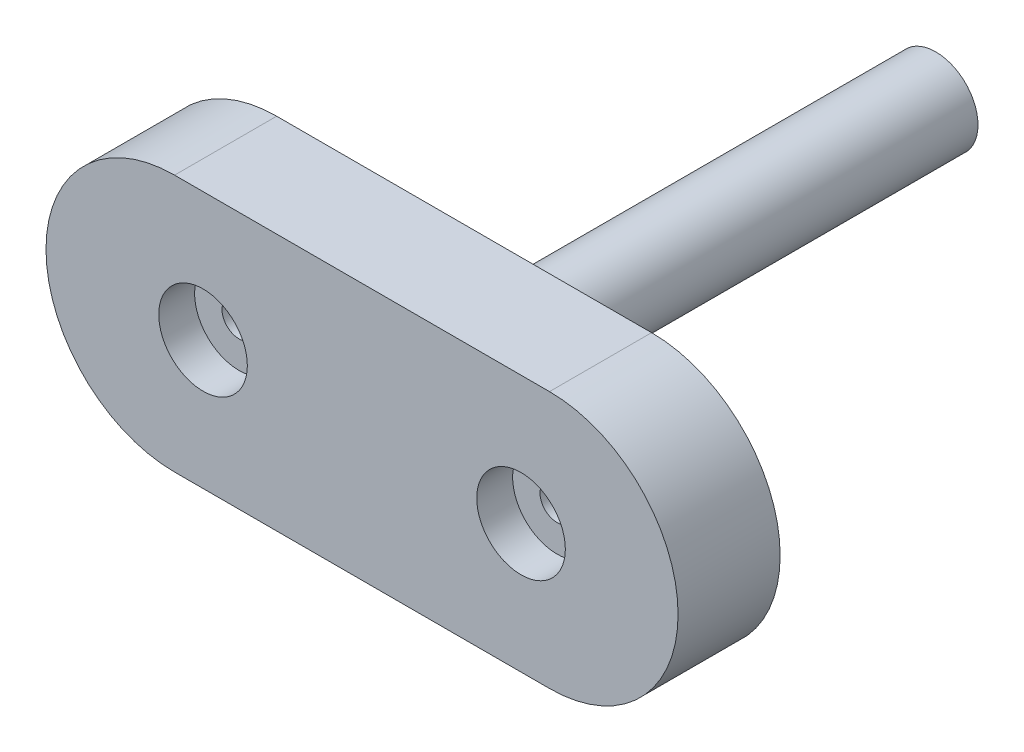
ISO-10303-21;
HEADER;
FILE_DESCRIPTION(('STEP AP214'),'2;1');
FILE_NAME('part.step','',(''),(''),'','','');
FILE_SCHEMA(('AUTOMOTIVE_DESIGN { 1 0 10303 214 1 1 1 1 }'));
ENDSEC;
DATA;
#1=APPLICATION_CONTEXT('core data for automotive mechanical design processes');
#2=APPLICATION_PROTOCOL_DEFINITION('international standard','automotive_design',2000,#1);
#3=PRODUCT_CONTEXT('',#1,'mechanical');
#4=PRODUCT('Part','Part','',(#3));
#5=PRODUCT_RELATED_PRODUCT_CATEGORY('part','',(#4));
#6=PRODUCT_DEFINITION_FORMATION('','',#4);
#7=PRODUCT_DEFINITION_CONTEXT('part definition',#1,'design');
#8=PRODUCT_DEFINITION('design','',#6,#7);
#9=PRODUCT_DEFINITION_SHAPE('','',#8);
#10=(LENGTH_UNIT() NAMED_UNIT(*) SI_UNIT(.MILLI.,.METRE.));
#11=(NAMED_UNIT(*) PLANE_ANGLE_UNIT() SI_UNIT($,.RADIAN.));
#12=(NAMED_UNIT(*) SI_UNIT($,.STERADIAN.) SOLID_ANGLE_UNIT());
#13=UNCERTAINTY_MEASURE_WITH_UNIT(LENGTH_MEASURE(1.E-05),#10,'distance_accuracy_value','');
#14=(GEOMETRIC_REPRESENTATION_CONTEXT(3) GLOBAL_UNCERTAINTY_ASSIGNED_CONTEXT((#13)) GLOBAL_UNIT_ASSIGNED_CONTEXT((#10,
#11,#12)) REPRESENTATION_CONTEXT('',''));
#15=CARTESIAN_POINT('',(0.,0.,0.));
#16=DIRECTION('',(0.,0.,1.));
#17=DIRECTION('',(1.,0.,0.));
#18=AXIS2_PLACEMENT_3D('',#15,#16,#17);
#19=CARTESIAN_POINT('',(-15.,0.,-54.13));
#20=DIRECTION('',(0.,0.,1.));
#21=DIRECTION('',(1.,0.,0.));
#22=AXIS2_PLACEMENT_3D('',#19,#20,#21);
#23=CYLINDRICAL_SURFACE('',#22,1.6);
#24=CARTESIAN_POINT('',(-15.,0.,-9.63));
#25=DIRECTION('',(0.,0.,1.));
#26=DIRECTION('',(1.,0.,0.));
#27=AXIS2_PLACEMENT_3D('',#24,#25,#26);
#28=CIRCLE('',#27,1.6);
#29=CARTESIAN_POINT('',(-13.4,0.,-9.63));
#30=VERTEX_POINT('',#29);
#31=EDGE_CURVE('E141',#30,#30,#28,.T.);
#32=ORIENTED_EDGE('',*,*,#31,.F.);
#33=EDGE_LOOP('',(#32));
#34=FACE_BOUND('',#33,.T.);
#35=CARTESIAN_POINT('',(-15.,0.,-3.39));
#36=DIRECTION('',(0.,0.,1.));
#37=DIRECTION('',(1.,0.,0.));
#38=AXIS2_PLACEMENT_3D('',#35,#36,#37);
#39=CIRCLE('',#38,1.6);
#40=CARTESIAN_POINT('',(-13.4,0.,-3.39));
#41=VERTEX_POINT('',#40);
#42=EDGE_CURVE('E42',#41,#41,#39,.F.);
#43=ORIENTED_EDGE('',*,*,#42,.F.);
#44=EDGE_LOOP('',(#43));
#45=FACE_BOUND('',#44,.T.);
#46=ADVANCED_FACE('F38',(#34,#45),#23,.F.);
#47=CARTESIAN_POINT('',(15.,0.,-54.13));
#48=DIRECTION('',(0.,0.,1.));
#49=DIRECTION('',(1.,0.,0.));
#50=AXIS2_PLACEMENT_3D('',#47,#48,#49);
#51=CYLINDRICAL_SURFACE('',#50,1.6);
#52=CARTESIAN_POINT('',(15.,0.,-9.63));
#53=DIRECTION('',(0.,0.,1.));
#54=DIRECTION('',(1.,0.,0.));
#55=AXIS2_PLACEMENT_3D('',#52,#53,#54);
#56=CIRCLE('',#55,1.6);
#57=CARTESIAN_POINT('',(16.6,0.,-9.63));
#58=VERTEX_POINT('',#57);
#59=EDGE_CURVE('E162',#58,#58,#56,.T.);
#60=ORIENTED_EDGE('',*,*,#59,.F.);
#61=EDGE_LOOP('',(#60));
#62=FACE_BOUND('',#61,.T.);
#63=CARTESIAN_POINT('',(15.,0.,-3.39));
#64=DIRECTION('',(0.,0.,1.));
#65=DIRECTION('',(1.,0.,0.));
#66=AXIS2_PLACEMENT_3D('',#63,#64,#65);
#67=CIRCLE('',#66,1.6);
#68=CARTESIAN_POINT('',(16.6,0.,-3.39));
#69=VERTEX_POINT('',#68);
#70=EDGE_CURVE('E132',#69,#69,#67,.F.);
#71=ORIENTED_EDGE('',*,*,#70,.F.);
#72=EDGE_LOOP('',(#71));
#73=FACE_BOUND('',#72,.T.);
#74=ADVANCED_FACE('F190',(#62,#73),#51,.F.);
#75=CARTESIAN_POINT('',(-17.685,0.,-9.63));
#76=DIRECTION('',(0.,0.,1.));
#77=DIRECTION('',(1.,0.,0.));
#78=AXIS2_PLACEMENT_3D('',#75,#76,#77);
#79=CYLINDRICAL_SURFACE('',#78,12.13);
#80=CARTESIAN_POINT('',(-17.685,0.,0.));
#81=DIRECTION('',(0.,0.,1.));
#82=DIRECTION('',(1.,0.,0.));
#83=AXIS2_PLACEMENT_3D('',#80,#81,#82);
#84=CIRCLE('',#83,12.13);
#85=CARTESIAN_POINT('',(-17.685,12.13,0.));
#86=VERTEX_POINT('',#85);
#87=CARTESIAN_POINT('',(-17.685,-12.13,0.));
#88=VERTEX_POINT('',#87);
#89=EDGE_CURVE('E114',#86,#88,#84,.T.);
#90=ORIENTED_EDGE('',*,*,#89,.F.);
#91=DIRECTION('',(0.,0.,1.));
#92=VECTOR('',#91,1.);
#93=CARTESIAN_POINT('',(-17.685,12.13,-9.63));
#94=LINE('',#93,#92);
#95=CARTESIAN_POINT('',(-17.685,12.13,-9.63));
#96=VERTEX_POINT('',#95);
#97=EDGE_CURVE('E49',#96,#86,#94,.T.);
#98=ORIENTED_EDGE('',*,*,#97,.F.);
#99=CARTESIAN_POINT('',(-17.685,0.,-9.63));
#100=DIRECTION('',(0.,0.,1.));
#101=DIRECTION('',(1.,0.,0.));
#102=AXIS2_PLACEMENT_3D('',#99,#100,#101);
#103=CIRCLE('',#102,12.13);
#104=CARTESIAN_POINT('',(-17.685,-12.13,-9.63));
#105=VERTEX_POINT('',#104);
#106=EDGE_CURVE('E105',#96,#105,#103,.T.);
#107=ORIENTED_EDGE('',*,*,#106,.T.);
#108=DIRECTION('',(0.,0.,1.));
#109=VECTOR('',#108,1.);
#110=CARTESIAN_POINT('',(-17.685,-12.13,-9.63));
#111=LINE('',#110,#109);
#112=EDGE_CURVE('E85',#105,#88,#111,.T.);
#113=ORIENTED_EDGE('',*,*,#112,.T.);
#114=EDGE_LOOP('',(#90,#98,#107,#113));
#115=FACE_BOUND('',#114,.T.);
#116=ADVANCED_FACE('F40',(#115),#79,.T.);
#117=CARTESIAN_POINT('',(-17.685,12.13,-9.63));
#118=DIRECTION('',(0.,1.,0.));
#119=DIRECTION('',(0.,0.,1.));
#120=AXIS2_PLACEMENT_3D('',#117,#118,#119);
#121=PLANE('',#120);
#122=DIRECTION('',(-1.,0.,0.));
#123=VECTOR('',#122,1.);
#124=CARTESIAN_POINT('',(-17.685,12.13,0.));
#125=LINE('',#124,#123);
#126=CARTESIAN_POINT('',(17.685,12.13,0.));
#127=VERTEX_POINT('',#126);
#128=EDGE_CURVE('E108',#127,#86,#125,.T.);
#129=ORIENTED_EDGE('',*,*,#128,.F.);
#130=DIRECTION('',(0.,0.,1.));
#131=VECTOR('',#130,1.);
#132=CARTESIAN_POINT('',(17.685,12.13,-9.63));
#133=LINE('',#132,#131);
#134=CARTESIAN_POINT('',(17.685,12.13,-9.63));
#135=VERTEX_POINT('',#134);
#136=EDGE_CURVE('E74',#135,#127,#133,.T.);
#137=ORIENTED_EDGE('',*,*,#136,.F.);
#138=DIRECTION('',(-1.,0.,0.));
#139=VECTOR('',#138,1.);
#140=CARTESIAN_POINT('',(-17.685,12.13,-9.63));
#141=LINE('',#140,#139);
#142=EDGE_CURVE('E100',#135,#96,#141,.T.);
#143=ORIENTED_EDGE('',*,*,#142,.T.);
#144=ORIENTED_EDGE('',*,*,#97,.T.);
#145=EDGE_LOOP('',(#129,#137,#143,#144));
#146=FACE_BOUND('',#145,.T.);
#147=ADVANCED_FACE('F283',(#146),#121,.T.);
#148=CARTESIAN_POINT('',(17.685,0.,-9.63));
#149=DIRECTION('',(0.,0.,1.));
#150=DIRECTION('',(1.,0.,0.));
#151=AXIS2_PLACEMENT_3D('',#148,#149,#150);
#152=CYLINDRICAL_SURFACE('',#151,12.13);
#153=CARTESIAN_POINT('',(17.685,0.,0.));
#154=DIRECTION('',(0.,0.,1.));
#155=DIRECTION('',(1.,0.,0.));
#156=AXIS2_PLACEMENT_3D('',#153,#154,#155);
#157=CIRCLE('',#156,12.13);
#158=CARTESIAN_POINT('',(17.685,-12.13,0.));
#159=VERTEX_POINT('',#158);
#160=EDGE_CURVE('E93',#159,#127,#157,.T.);
#161=ORIENTED_EDGE('',*,*,#160,.F.);
#162=DIRECTION('',(0.,0.,1.));
#163=VECTOR('',#162,1.);
#164=CARTESIAN_POINT('',(17.685,-12.13,-9.63));
#165=LINE('',#164,#163);
#166=CARTESIAN_POINT('',(17.685,-12.13,-9.63));
#167=VERTEX_POINT('',#166);
#168=EDGE_CURVE('E88',#167,#159,#165,.T.);
#169=ORIENTED_EDGE('',*,*,#168,.F.);
#170=CARTESIAN_POINT('',(17.685,0.,-9.63));
#171=DIRECTION('',(0.,0.,1.));
#172=DIRECTION('',(1.,0.,0.));
#173=AXIS2_PLACEMENT_3D('',#170,#171,#172);
#174=CIRCLE('',#173,12.13);
#175=EDGE_CURVE('E91',#167,#135,#174,.T.);
#176=ORIENTED_EDGE('',*,*,#175,.T.);
#177=ORIENTED_EDGE('',*,*,#136,.T.);
#178=EDGE_LOOP('',(#161,#169,#176,#177));
#179=FACE_BOUND('',#178,.T.);
#180=ADVANCED_FACE('F90',(#179),#152,.T.);
#181=CARTESIAN_POINT('',(-17.685,-12.13,-9.63));
#182=DIRECTION('',(0.,-1.,0.));
#183=DIRECTION('',(0.,0.,-1.));
#184=AXIS2_PLACEMENT_3D('',#181,#182,#183);
#185=PLANE('',#184);
#186=DIRECTION('',(1.,0.,0.));
#187=VECTOR('',#186,1.);
#188=CARTESIAN_POINT('',(-17.685,-12.13,0.));
#189=LINE('',#188,#187);
#190=EDGE_CURVE('E118',#88,#159,#189,.T.);
#191=ORIENTED_EDGE('',*,*,#190,.F.);
#192=ORIENTED_EDGE('',*,*,#112,.F.);
#193=DIRECTION('',(1.,0.,0.));
#194=VECTOR('',#193,1.);
#195=CARTESIAN_POINT('',(-17.685,-12.13,-9.63));
#196=LINE('',#195,#194);
#197=EDGE_CURVE('E99',#105,#167,#196,.T.);
#198=ORIENTED_EDGE('',*,*,#197,.T.);
#199=ORIENTED_EDGE('',*,*,#168,.T.);
#200=EDGE_LOOP('',(#191,#192,#198,#199));
#201=FACE_BOUND('',#200,.T.);
#202=ADVANCED_FACE('F103',(#201),#185,.T.);
#203=CARTESIAN_POINT('',(-17.685,0.,-9.63));
#204=DIRECTION('',(0.,0.,1.));
#205=DIRECTION('',(1.,0.,0.));
#206=AXIS2_PLACEMENT_3D('',#203,#204,#205);
#207=PLANE('',#206);
#208=ORIENTED_EDGE('',*,*,#59,.T.);
#209=EDGE_LOOP('',(#208));
#210=FACE_BOUND('',#209,.T.);
#211=ORIENTED_EDGE('',*,*,#31,.T.);
#212=EDGE_LOOP('',(#211));
#213=FACE_BOUND('',#212,.T.);
#214=CARTESIAN_POINT('',(0.,0.,-9.63));
#215=DIRECTION('',(0.,0.,1.));
#216=DIRECTION('',(1.,0.,0.));
#217=AXIS2_PLACEMENT_3D('',#214,#215,#216);
#218=CIRCLE('',#217,3.98);
#219=CARTESIAN_POINT('',(3.98,0.,-9.63));
#220=VERTEX_POINT('',#219);
#221=EDGE_CURVE('E11',#220,#220,#218,.F.);
#222=ORIENTED_EDGE('',*,*,#221,.F.);
#223=EDGE_LOOP('',(#222));
#224=FACE_BOUND('',#223,.T.);
#225=ORIENTED_EDGE('',*,*,#106,.F.);
#226=ORIENTED_EDGE('',*,*,#142,.F.);
#227=ORIENTED_EDGE('',*,*,#175,.F.);
#228=ORIENTED_EDGE('',*,*,#197,.F.);
#229=EDGE_LOOP('',(#225,#226,#227,#228));
#230=FACE_BOUND('',#229,.T.);
#231=ADVANCED_FACE('F98',(#210,#213,#224,#230),#207,.F.);
#232=CARTESIAN_POINT('',(-17.685,0.,0.));
#233=DIRECTION('',(0.,0.,1.));
#234=DIRECTION('',(1.,0.,0.));
#235=AXIS2_PLACEMENT_3D('',#232,#233,#234);
#236=PLANE('',#235);
#237=CARTESIAN_POINT('',(-15.,0.,0.));
#238=DIRECTION('',(0.,0.,1.));
#239=DIRECTION('',(1.,0.,0.));
#240=AXIS2_PLACEMENT_3D('',#237,#238,#239);
#241=CIRCLE('',#240,4.18);
#242=CARTESIAN_POINT('',(-10.82,0.,0.));
#243=VERTEX_POINT('',#242);
#244=EDGE_CURVE('E143',#243,#243,#241,.T.);
#245=ORIENTED_EDGE('',*,*,#244,.F.);
#246=EDGE_LOOP('',(#245));
#247=FACE_BOUND('',#246,.T.);
#248=CARTESIAN_POINT('',(15.,0.,0.));
#249=DIRECTION('',(0.,0.,1.));
#250=DIRECTION('',(1.,0.,0.));
#251=AXIS2_PLACEMENT_3D('',#248,#249,#250);
#252=CIRCLE('',#251,4.18);
#253=CARTESIAN_POINT('',(19.18,0.,0.));
#254=VERTEX_POINT('',#253);
#255=EDGE_CURVE('E155',#254,#254,#252,.T.);
#256=ORIENTED_EDGE('',*,*,#255,.F.);
#257=EDGE_LOOP('',(#256));
#258=FACE_BOUND('',#257,.T.);
#259=ORIENTED_EDGE('',*,*,#89,.T.);
#260=ORIENTED_EDGE('',*,*,#190,.T.);
#261=ORIENTED_EDGE('',*,*,#160,.T.);
#262=ORIENTED_EDGE('',*,*,#128,.T.);
#263=EDGE_LOOP('',(#259,#260,#261,#262));
#264=FACE_BOUND('',#263,.T.);
#265=ADVANCED_FACE('F174',(#247,#258,#264),#236,.T.);
#266=CARTESIAN_POINT('',(0.,0.,-54.13));
#267=DIRECTION('',(0.,0.,1.));
#268=DIRECTION('',(1.,0.,0.));
#269=AXIS2_PLACEMENT_3D('',#266,#267,#268);
#270=CYLINDRICAL_SURFACE('',#269,3.98);
#271=CARTESIAN_POINT('',(0.,0.,-54.13));
#272=DIRECTION('',(0.,0.,-1.));
#273=DIRECTION('',(-1.,0.,0.));
#274=AXIS2_PLACEMENT_3D('',#271,#272,#273);
#275=CIRCLE('',#274,3.98);
#276=CARTESIAN_POINT('',(-3.98,0.,-54.13));
#277=VERTEX_POINT('',#276);
#278=EDGE_CURVE('E119',#277,#277,#275,.T.);
#279=ORIENTED_EDGE('',*,*,#278,.F.);
#280=EDGE_LOOP('',(#279));
#281=FACE_BOUND('',#280,.T.);
#282=ORIENTED_EDGE('',*,*,#221,.T.);
#283=EDGE_LOOP('',(#282));
#284=FACE_BOUND('',#283,.T.);
#285=ADVANCED_FACE('F171',(#281,#284),#270,.T.);
#286=CARTESIAN_POINT('',(0.,0.,-54.13));
#287=DIRECTION('',(0.,0.,-1.));
#288=DIRECTION('',(-1.,0.,0.));
#289=AXIS2_PLACEMENT_3D('',#286,#287,#288);
#290=PLANE('',#289);
#291=ORIENTED_EDGE('',*,*,#278,.T.);
#292=EDGE_LOOP('',(#291));
#293=FACE_BOUND('',#292,.T.);
#294=ADVANCED_FACE('F169',(#293),#290,.T.);
#295=CARTESIAN_POINT('',(15.,0.,-3.39));
#296=DIRECTION('',(0.,0.,1.));
#297=DIRECTION('',(1.,0.,0.));
#298=AXIS2_PLACEMENT_3D('',#295,#296,#297);
#299=PLANE('',#298);
#300=CARTESIAN_POINT('',(15.,0.,-3.39));
#301=DIRECTION('',(0.,0.,1.));
#302=DIRECTION('',(1.,0.,0.));
#303=AXIS2_PLACEMENT_3D('',#300,#301,#302);
#304=CIRCLE('',#303,4.18);
#305=CARTESIAN_POINT('',(19.18,0.,-3.39));
#306=VERTEX_POINT('',#305);
#307=EDGE_CURVE('E149',#306,#306,#304,.T.);
#308=ORIENTED_EDGE('',*,*,#307,.T.);
#309=EDGE_LOOP('',(#308));
#310=FACE_BOUND('',#309,.T.);
#311=ORIENTED_EDGE('',*,*,#70,.T.);
#312=EDGE_LOOP('',(#311));
#313=FACE_BOUND('',#312,.T.);
#314=ADVANCED_FACE('F203',(#310,#313),#299,.T.);
#315=CARTESIAN_POINT('',(15.,0.,-3.39));
#316=DIRECTION('',(0.,0.,1.));
#317=DIRECTION('',(1.,0.,0.));
#318=AXIS2_PLACEMENT_3D('',#315,#316,#317);
#319=CYLINDRICAL_SURFACE('',#318,4.18);
#320=ORIENTED_EDGE('',*,*,#307,.F.);
#321=EDGE_LOOP('',(#320));
#322=FACE_BOUND('',#321,.T.);
#323=ORIENTED_EDGE('',*,*,#255,.T.);
#324=EDGE_LOOP('',(#323));
#325=FACE_BOUND('',#324,.T.);
#326=ADVANCED_FACE('F207',(#322,#325),#319,.F.);
#327=CARTESIAN_POINT('',(-15.,0.,-3.39));
#328=DIRECTION('',(0.,0.,1.));
#329=DIRECTION('',(1.,0.,0.));
#330=AXIS2_PLACEMENT_3D('',#327,#328,#329);
#331=PLANE('',#330);
#332=CARTESIAN_POINT('',(-15.,0.,-3.39));
#333=DIRECTION('',(0.,0.,1.));
#334=DIRECTION('',(1.,0.,0.));
#335=AXIS2_PLACEMENT_3D('',#332,#333,#334);
#336=CIRCLE('',#335,4.18);
#337=CARTESIAN_POINT('',(-10.82,0.,-3.39));
#338=VERTEX_POINT('',#337);
#339=EDGE_CURVE('E135',#338,#338,#336,.T.);
#340=ORIENTED_EDGE('',*,*,#339,.T.);
#341=EDGE_LOOP('',(#340));
#342=FACE_BOUND('',#341,.T.);
#343=ORIENTED_EDGE('',*,*,#42,.T.);
#344=EDGE_LOOP('',(#343));
#345=FACE_BOUND('',#344,.T.);
#346=ADVANCED_FACE('F214',(#342,#345),#331,.T.);
#347=CARTESIAN_POINT('',(-15.,0.,-3.39));
#348=DIRECTION('',(0.,0.,1.));
#349=DIRECTION('',(1.,0.,0.));
#350=AXIS2_PLACEMENT_3D('',#347,#348,#349);
#351=CYLINDRICAL_SURFACE('',#350,4.18);
#352=ORIENTED_EDGE('',*,*,#339,.F.);
#353=EDGE_LOOP('',(#352));
#354=FACE_BOUND('',#353,.T.);
#355=ORIENTED_EDGE('',*,*,#244,.T.);
#356=EDGE_LOOP('',(#355));
#357=FACE_BOUND('',#356,.T.);
#358=ADVANCED_FACE('F217',(#354,#357),#351,.F.);
#359=CLOSED_SHELL('',(#46,#74,#116,#147,#180,#202,#231,#265,#285,#294,#314,#326,#346,#358));
#360=MANIFOLD_SOLID_BREP('B2',#359);
#361=ADVANCED_BREP_SHAPE_REPRESENTATION('',(#18,#360),#14);
#362=SHAPE_DEFINITION_REPRESENTATION(#9,#361);
ENDSEC;
END-ISO-10303-21;
